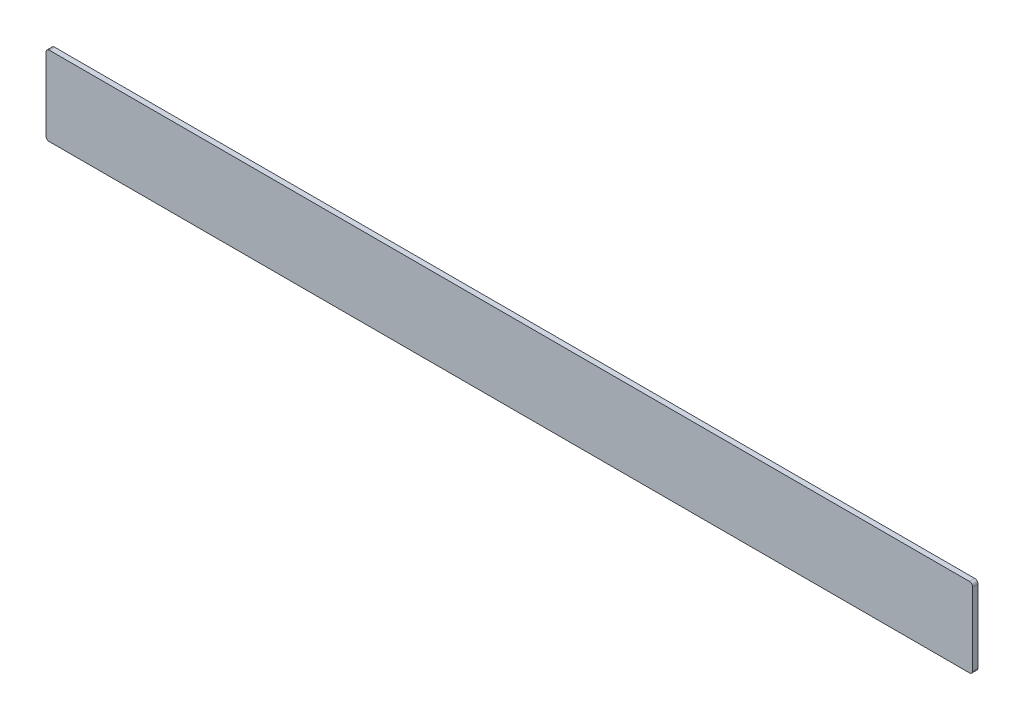
ISO-10303-21;
HEADER;
FILE_DESCRIPTION(('STEP AP214'),'2;1');
FILE_NAME('part.step','',(''),(''),'','','');
FILE_SCHEMA(('AUTOMOTIVE_DESIGN { 1 0 10303 214 1 1 1 1 }'));
ENDSEC;
DATA;
#1=APPLICATION_CONTEXT('core data for automotive mechanical design processes');
#2=APPLICATION_PROTOCOL_DEFINITION('international standard','automotive_design',2000,#1);
#3=PRODUCT_CONTEXT('',#1,'mechanical');
#4=PRODUCT('Part','Part','',(#3));
#5=PRODUCT_RELATED_PRODUCT_CATEGORY('part','',(#4));
#6=PRODUCT_DEFINITION_FORMATION('','',#4);
#7=PRODUCT_DEFINITION_CONTEXT('part definition',#1,'design');
#8=PRODUCT_DEFINITION('design','',#6,#7);
#9=PRODUCT_DEFINITION_SHAPE('','',#8);
#10=(LENGTH_UNIT() NAMED_UNIT(*) SI_UNIT(.MILLI.,.METRE.));
#11=(NAMED_UNIT(*) PLANE_ANGLE_UNIT() SI_UNIT($,.RADIAN.));
#12=(NAMED_UNIT(*) SI_UNIT($,.STERADIAN.) SOLID_ANGLE_UNIT());
#13=UNCERTAINTY_MEASURE_WITH_UNIT(LENGTH_MEASURE(1.E-05),#10,'distance_accuracy_value','');
#14=(GEOMETRIC_REPRESENTATION_CONTEXT(3) GLOBAL_UNCERTAINTY_ASSIGNED_CONTEXT((#13)) GLOBAL_UNIT_ASSIGNED_CONTEXT((#10,
#11,#12)) REPRESENTATION_CONTEXT('',''));
#15=CARTESIAN_POINT('',(0.,0.,0.));
#16=DIRECTION('',(0.,0.,1.));
#17=DIRECTION('',(1.,0.,0.));
#18=AXIS2_PLACEMENT_3D('',#15,#16,#17);
#19=CARTESIAN_POINT('',(697.,-55.,4.));
#20=DIRECTION('',(0.,0.,-1.));
#21=DIRECTION('',(-1.,0.,0.));
#22=AXIS2_PLACEMENT_3D('',#19,#20,#21);
#23=CYLINDRICAL_SURFACE('',#22,5.);
#24=CARTESIAN_POINT('',(697.,-55.,-4.));
#25=DIRECTION('',(0.,0.,1.));
#26=DIRECTION('',(-1.,0.,0.));
#27=AXIS2_PLACEMENT_3D('',#24,#25,#26);
#28=CIRCLE('',#27,5.);
#29=CARTESIAN_POINT('',(697.,-60.,-4.));
#30=VERTEX_POINT('',#29);
#31=CARTESIAN_POINT('',(702.,-55.,-4.));
#32=VERTEX_POINT('',#31);
#33=EDGE_CURVE('E129',#30,#32,#28,.T.);
#34=ORIENTED_EDGE('',*,*,#33,.T.);
#35=DIRECTION('',(0.,0.,-1.));
#36=VECTOR('',#35,1.);
#37=CARTESIAN_POINT('',(702.,-55.,4.));
#38=LINE('',#37,#36);
#39=CARTESIAN_POINT('',(702.,-55.,4.));
#40=VERTEX_POINT('',#39);
#41=EDGE_CURVE('E11',#40,#32,#38,.T.);
#42=ORIENTED_EDGE('',*,*,#41,.F.);
#43=CARTESIAN_POINT('',(697.,-55.,4.));
#44=DIRECTION('',(0.,0.,1.));
#45=DIRECTION('',(-1.,0.,0.));
#46=AXIS2_PLACEMENT_3D('',#43,#44,#45);
#47=CIRCLE('',#46,5.);
#48=CARTESIAN_POINT('',(697.,-60.,4.));
#49=VERTEX_POINT('',#48);
#50=EDGE_CURVE('E143',#49,#40,#47,.T.);
#51=ORIENTED_EDGE('',*,*,#50,.F.);
#52=DIRECTION('',(0.,0.,-1.));
#53=VECTOR('',#52,1.);
#54=CARTESIAN_POINT('',(697.,-60.,4.));
#55=LINE('',#54,#53);
#56=EDGE_CURVE('E125',#49,#30,#55,.T.);
#57=ORIENTED_EDGE('',*,*,#56,.T.);
#58=EDGE_LOOP('',(#34,#42,#51,#57));
#59=FACE_BOUND('',#58,.T.);
#60=ADVANCED_FACE('F33',(#59),#23,.T.);
#61=CARTESIAN_POINT('',(702.,-55.,4.));
#62=DIRECTION('',(-1.,0.,0.));
#63=DIRECTION('',(0.,0.,1.));
#64=AXIS2_PLACEMENT_3D('',#61,#62,#63);
#65=PLANE('',#64);
#66=DIRECTION('',(0.,1.,0.));
#67=VECTOR('',#66,1.);
#68=CARTESIAN_POINT('',(702.,-55.,-4.));
#69=LINE('',#68,#67);
#70=CARTESIAN_POINT('',(702.,55.,-4.));
#71=VERTEX_POINT('',#70);
#72=EDGE_CURVE('E132',#32,#71,#69,.T.);
#73=ORIENTED_EDGE('',*,*,#72,.T.);
#74=DIRECTION('',(0.,0.,-1.));
#75=VECTOR('',#74,1.);
#76=CARTESIAN_POINT('',(702.,55.,4.));
#77=LINE('',#76,#75);
#78=CARTESIAN_POINT('',(702.,55.,4.));
#79=VERTEX_POINT('',#78);
#80=EDGE_CURVE('E41',#79,#71,#77,.T.);
#81=ORIENTED_EDGE('',*,*,#80,.F.);
#82=DIRECTION('',(0.,1.,0.));
#83=VECTOR('',#82,1.);
#84=CARTESIAN_POINT('',(702.,-55.,4.));
#85=LINE('',#84,#83);
#86=EDGE_CURVE('E92',#40,#79,#85,.T.);
#87=ORIENTED_EDGE('',*,*,#86,.F.);
#88=ORIENTED_EDGE('',*,*,#41,.T.);
#89=EDGE_LOOP('',(#73,#81,#87,#88));
#90=FACE_BOUND('',#89,.T.);
#91=ADVANCED_FACE('F178',(#90),#65,.F.);
#92=CARTESIAN_POINT('',(697.,55.,4.));
#93=DIRECTION('',(0.,0.,-1.));
#94=DIRECTION('',(-1.,0.,0.));
#95=AXIS2_PLACEMENT_3D('',#92,#93,#94);
#96=CYLINDRICAL_SURFACE('',#95,5.);
#97=CARTESIAN_POINT('',(697.,55.,-4.));
#98=DIRECTION('',(0.,0.,1.));
#99=DIRECTION('',(1.,0.,0.));
#100=AXIS2_PLACEMENT_3D('',#97,#98,#99);
#101=CIRCLE('',#100,5.);
#102=CARTESIAN_POINT('',(697.,60.,-4.));
#103=VERTEX_POINT('',#102);
#104=EDGE_CURVE('E134',#71,#103,#101,.T.);
#105=ORIENTED_EDGE('',*,*,#104,.T.);
#106=DIRECTION('',(0.,0.,-1.));
#107=VECTOR('',#106,1.);
#108=CARTESIAN_POINT('',(697.,60.,4.));
#109=LINE('',#108,#107);
#110=CARTESIAN_POINT('',(697.,60.,4.));
#111=VERTEX_POINT('',#110);
#112=EDGE_CURVE('E150',#111,#103,#109,.T.);
#113=ORIENTED_EDGE('',*,*,#112,.F.);
#114=CARTESIAN_POINT('',(697.,55.,4.));
#115=DIRECTION('',(0.,0.,1.));
#116=DIRECTION('',(1.,0.,0.));
#117=AXIS2_PLACEMENT_3D('',#114,#115,#116);
#118=CIRCLE('',#117,5.);
#119=EDGE_CURVE('E158',#79,#111,#118,.T.);
#120=ORIENTED_EDGE('',*,*,#119,.F.);
#121=ORIENTED_EDGE('',*,*,#80,.T.);
#122=EDGE_LOOP('',(#105,#113,#120,#121));
#123=FACE_BOUND('',#122,.T.);
#124=ADVANCED_FACE('F156',(#123),#96,.T.);
#125=CARTESIAN_POINT('',(-697.,60.,4.));
#126=DIRECTION('',(0.,-1.,0.));
#127=DIRECTION('',(0.,0.,-1.));
#128=AXIS2_PLACEMENT_3D('',#125,#126,#127);
#129=PLANE('',#128);
#130=DIRECTION('',(-1.,0.,0.));
#131=VECTOR('',#130,1.);
#132=CARTESIAN_POINT('',(-697.,60.,-4.));
#133=LINE('',#132,#131);
#134=CARTESIAN_POINT('',(-697.,60.,-4.));
#135=VERTEX_POINT('',#134);
#136=EDGE_CURVE('E136',#103,#135,#133,.T.);
#137=ORIENTED_EDGE('',*,*,#136,.T.);
#138=DIRECTION('',(0.,0.,-1.));
#139=VECTOR('',#138,1.);
#140=CARTESIAN_POINT('',(-697.,60.,4.));
#141=LINE('',#140,#139);
#142=CARTESIAN_POINT('',(-697.,60.,4.));
#143=VERTEX_POINT('',#142);
#144=EDGE_CURVE('E147',#143,#135,#141,.T.);
#145=ORIENTED_EDGE('',*,*,#144,.F.);
#146=DIRECTION('',(-1.,0.,0.));
#147=VECTOR('',#146,1.);
#148=CARTESIAN_POINT('',(-697.,60.,4.));
#149=LINE('',#148,#147);
#150=EDGE_CURVE('E170',#111,#143,#149,.T.);
#151=ORIENTED_EDGE('',*,*,#150,.F.);
#152=ORIENTED_EDGE('',*,*,#112,.T.);
#153=EDGE_LOOP('',(#137,#145,#151,#152));
#154=FACE_BOUND('',#153,.T.);
#155=ADVANCED_FACE('F166',(#154),#129,.F.);
#156=CARTESIAN_POINT('',(-697.,55.,4.));
#157=DIRECTION('',(0.,0.,-1.));
#158=DIRECTION('',(-1.,0.,0.));
#159=AXIS2_PLACEMENT_3D('',#156,#157,#158);
#160=CYLINDRICAL_SURFACE('',#159,5.);
#161=CARTESIAN_POINT('',(-697.,55.,-4.));
#162=DIRECTION('',(0.,0.,1.));
#163=DIRECTION('',(-1.,0.,0.));
#164=AXIS2_PLACEMENT_3D('',#161,#162,#163);
#165=CIRCLE('',#164,5.);
#166=CARTESIAN_POINT('',(-702.,55.,-4.));
#167=VERTEX_POINT('',#166);
#168=EDGE_CURVE('E138',#135,#167,#165,.T.);
#169=ORIENTED_EDGE('',*,*,#168,.T.);
#170=DIRECTION('',(0.,0.,-1.));
#171=VECTOR('',#170,1.);
#172=CARTESIAN_POINT('',(-702.,55.,4.));
#173=LINE('',#172,#171);
#174=CARTESIAN_POINT('',(-702.,55.,4.));
#175=VERTEX_POINT('',#174);
#176=EDGE_CURVE('E120',#175,#167,#173,.T.);
#177=ORIENTED_EDGE('',*,*,#176,.F.);
#178=CARTESIAN_POINT('',(-697.,55.,4.));
#179=DIRECTION('',(0.,0.,1.));
#180=DIRECTION('',(-1.,0.,0.));
#181=AXIS2_PLACEMENT_3D('',#178,#179,#180);
#182=CIRCLE('',#181,5.);
#183=EDGE_CURVE('E111',#143,#175,#182,.T.);
#184=ORIENTED_EDGE('',*,*,#183,.F.);
#185=ORIENTED_EDGE('',*,*,#144,.T.);
#186=EDGE_LOOP('',(#169,#177,#184,#185));
#187=FACE_BOUND('',#186,.T.);
#188=ADVANCED_FACE('F169',(#187),#160,.T.);
#189=CARTESIAN_POINT('',(-702.,-55.,4.));
#190=DIRECTION('',(1.,0.,0.));
#191=DIRECTION('',(0.,0.,-1.));
#192=AXIS2_PLACEMENT_3D('',#189,#190,#191);
#193=PLANE('',#192);
#194=DIRECTION('',(0.,-1.,0.));
#195=VECTOR('',#194,1.);
#196=CARTESIAN_POINT('',(-702.,-55.,-4.));
#197=LINE('',#196,#195);
#198=CARTESIAN_POINT('',(-702.,-55.,-4.));
#199=VERTEX_POINT('',#198);
#200=EDGE_CURVE('E119',#167,#199,#197,.T.);
#201=ORIENTED_EDGE('',*,*,#200,.T.);
#202=DIRECTION('',(0.,0.,-1.));
#203=VECTOR('',#202,1.);
#204=CARTESIAN_POINT('',(-702.,-55.,4.));
#205=LINE('',#204,#203);
#206=CARTESIAN_POINT('',(-702.,-55.,4.));
#207=VERTEX_POINT('',#206);
#208=EDGE_CURVE('E116',#207,#199,#205,.T.);
#209=ORIENTED_EDGE('',*,*,#208,.F.);
#210=DIRECTION('',(0.,-1.,0.));
#211=VECTOR('',#210,1.);
#212=CARTESIAN_POINT('',(-702.,-55.,4.));
#213=LINE('',#212,#211);
#214=EDGE_CURVE('E105',#175,#207,#213,.T.);
#215=ORIENTED_EDGE('',*,*,#214,.F.);
#216=ORIENTED_EDGE('',*,*,#176,.T.);
#217=EDGE_LOOP('',(#201,#209,#215,#216));
#218=FACE_BOUND('',#217,.T.);
#219=ADVANCED_FACE('F117',(#218),#193,.F.);
#220=CARTESIAN_POINT('',(-697.,-55.,4.));
#221=DIRECTION('',(0.,0.,-1.));
#222=DIRECTION('',(-1.,0.,0.));
#223=AXIS2_PLACEMENT_3D('',#220,#221,#222);
#224=CYLINDRICAL_SURFACE('',#223,5.);
#225=CARTESIAN_POINT('',(-697.,-55.,-4.));
#226=DIRECTION('',(0.,0.,1.));
#227=DIRECTION('',(-1.,0.,0.));
#228=AXIS2_PLACEMENT_3D('',#225,#226,#227);
#229=CIRCLE('',#228,5.);
#230=CARTESIAN_POINT('',(-697.,-60.,-4.));
#231=VERTEX_POINT('',#230);
#232=EDGE_CURVE('E78',#199,#231,#229,.T.);
#233=ORIENTED_EDGE('',*,*,#232,.T.);
#234=DIRECTION('',(0.,0.,-1.));
#235=VECTOR('',#234,1.);
#236=CARTESIAN_POINT('',(-697.,-60.,4.));
#237=LINE('',#236,#235);
#238=CARTESIAN_POINT('',(-697.,-60.,4.));
#239=VERTEX_POINT('',#238);
#240=EDGE_CURVE('E121',#239,#231,#237,.T.);
#241=ORIENTED_EDGE('',*,*,#240,.F.);
#242=CARTESIAN_POINT('',(-697.,-55.,4.));
#243=DIRECTION('',(0.,0.,1.));
#244=DIRECTION('',(-1.,0.,0.));
#245=AXIS2_PLACEMENT_3D('',#242,#243,#244);
#246=CIRCLE('',#245,5.);
#247=EDGE_CURVE('E109',#207,#239,#246,.T.);
#248=ORIENTED_EDGE('',*,*,#247,.F.);
#249=ORIENTED_EDGE('',*,*,#208,.T.);
#250=EDGE_LOOP('',(#233,#241,#248,#249));
#251=FACE_BOUND('',#250,.T.);
#252=ADVANCED_FACE('F123',(#251),#224,.T.);
#253=CARTESIAN_POINT('',(-697.,-60.,4.));
#254=DIRECTION('',(0.,1.,0.));
#255=DIRECTION('',(0.,0.,1.));
#256=AXIS2_PLACEMENT_3D('',#253,#254,#255);
#257=PLANE('',#256);
#258=DIRECTION('',(1.,0.,0.));
#259=VECTOR('',#258,1.);
#260=CARTESIAN_POINT('',(-697.,-60.,-4.));
#261=LINE('',#260,#259);
#262=EDGE_CURVE('E84',#231,#30,#261,.T.);
#263=ORIENTED_EDGE('',*,*,#262,.T.);
#264=ORIENTED_EDGE('',*,*,#56,.F.);
#265=DIRECTION('',(1.,0.,0.));
#266=VECTOR('',#265,1.);
#267=CARTESIAN_POINT('',(-697.,-60.,4.));
#268=LINE('',#267,#266);
#269=EDGE_CURVE('E49',#239,#49,#268,.T.);
#270=ORIENTED_EDGE('',*,*,#269,.F.);
#271=ORIENTED_EDGE('',*,*,#240,.T.);
#272=EDGE_LOOP('',(#263,#264,#270,#271));
#273=FACE_BOUND('',#272,.T.);
#274=ADVANCED_FACE('F194',(#273),#257,.F.);
#275=CARTESIAN_POINT('',(697.,-55.,4.));
#276=DIRECTION('',(0.,0.,-1.));
#277=DIRECTION('',(-1.,0.,0.));
#278=AXIS2_PLACEMENT_3D('',#275,#276,#277);
#279=PLANE('',#278);
#280=ORIENTED_EDGE('',*,*,#50,.T.);
#281=ORIENTED_EDGE('',*,*,#86,.T.);
#282=ORIENTED_EDGE('',*,*,#119,.T.);
#283=ORIENTED_EDGE('',*,*,#150,.T.);
#284=ORIENTED_EDGE('',*,*,#183,.T.);
#285=ORIENTED_EDGE('',*,*,#214,.T.);
#286=ORIENTED_EDGE('',*,*,#247,.T.);
#287=ORIENTED_EDGE('',*,*,#269,.T.);
#288=EDGE_LOOP('',(#280,#281,#282,#283,#284,#285,#286,#287));
#289=FACE_BOUND('',#288,.T.);
#290=ADVANCED_FACE('F107',(#289),#279,.F.);
#291=CARTESIAN_POINT('',(697.,-55.,-4.));
#292=DIRECTION('',(0.,0.,-1.));
#293=DIRECTION('',(-1.,0.,0.));
#294=AXIS2_PLACEMENT_3D('',#291,#292,#293);
#295=PLANE('',#294);
#296=ORIENTED_EDGE('',*,*,#33,.F.);
#297=ORIENTED_EDGE('',*,*,#262,.F.);
#298=ORIENTED_EDGE('',*,*,#232,.F.);
#299=ORIENTED_EDGE('',*,*,#200,.F.);
#300=ORIENTED_EDGE('',*,*,#168,.F.);
#301=ORIENTED_EDGE('',*,*,#136,.F.);
#302=ORIENTED_EDGE('',*,*,#104,.F.);
#303=ORIENTED_EDGE('',*,*,#72,.F.);
#304=EDGE_LOOP('',(#296,#297,#298,#299,#300,#301,#302,#303));
#305=FACE_BOUND('',#304,.T.);
#306=ADVANCED_FACE('F162',(#305),#295,.T.);
#307=CLOSED_SHELL('',(#60,#91,#124,#155,#188,#219,#252,#274,#290,#306));
#308=MANIFOLD_SOLID_BREP('B2',#307);
#309=ADVANCED_BREP_SHAPE_REPRESENTATION('',(#18,#308),#14);
#310=SHAPE_DEFINITION_REPRESENTATION(#9,#309);
ENDSEC;
END-ISO-10303-21;
